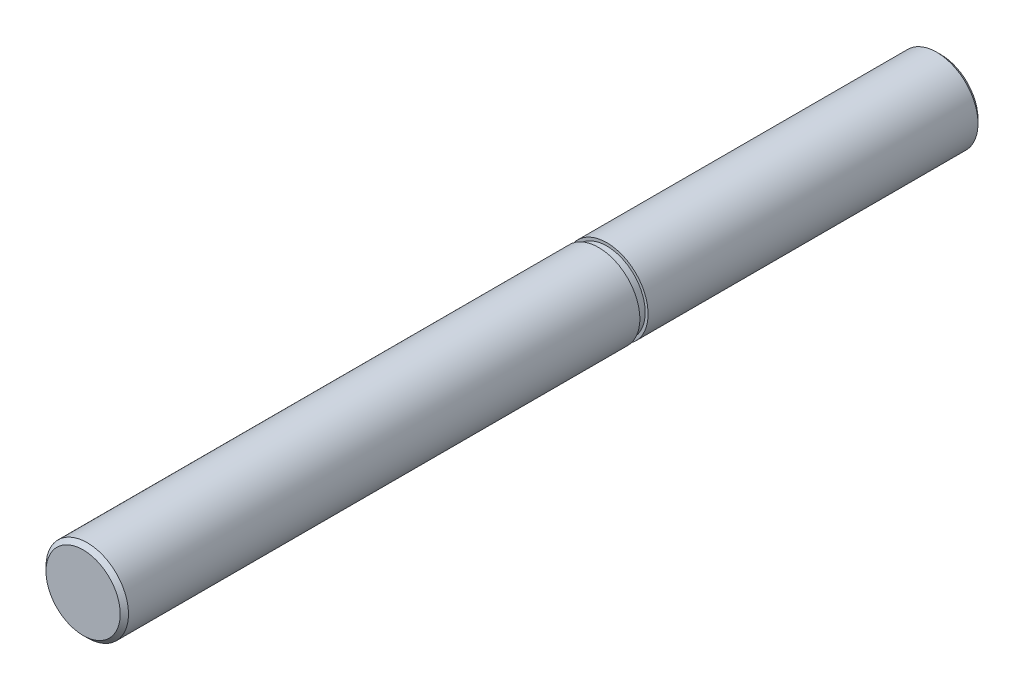
ISO-10303-21;
HEADER;
FILE_DESCRIPTION(('STEP AP214'),'2;1');
FILE_NAME('part.step','',(''),(''),'','','');
FILE_SCHEMA(('AUTOMOTIVE_DESIGN { 1 0 10303 214 1 1 1 1 }'));
ENDSEC;
DATA;
#1=APPLICATION_CONTEXT('core data for automotive mechanical design processes');
#2=APPLICATION_PROTOCOL_DEFINITION('international standard','automotive_design',2000,#1);
#3=PRODUCT_CONTEXT('',#1,'mechanical');
#4=PRODUCT('Part','Part','',(#3));
#5=PRODUCT_RELATED_PRODUCT_CATEGORY('part','',(#4));
#6=PRODUCT_DEFINITION_FORMATION('','',#4);
#7=PRODUCT_DEFINITION_CONTEXT('part definition',#1,'design');
#8=PRODUCT_DEFINITION('design','',#6,#7);
#9=PRODUCT_DEFINITION_SHAPE('','',#8);
#10=(LENGTH_UNIT() NAMED_UNIT(*) SI_UNIT(.MILLI.,.METRE.));
#11=(NAMED_UNIT(*) PLANE_ANGLE_UNIT() SI_UNIT($,.RADIAN.));
#12=(NAMED_UNIT(*) SI_UNIT($,.STERADIAN.) SOLID_ANGLE_UNIT());
#13=UNCERTAINTY_MEASURE_WITH_UNIT(LENGTH_MEASURE(1.E-05),#10,'distance_accuracy_value','');
#14=(GEOMETRIC_REPRESENTATION_CONTEXT(3) GLOBAL_UNCERTAINTY_ASSIGNED_CONTEXT((#13)) GLOBAL_UNIT_ASSIGNED_CONTEXT((#10,
#11,#12)) REPRESENTATION_CONTEXT('',''));
#15=CARTESIAN_POINT('',(0.,0.,0.));
#16=DIRECTION('',(0.,0.,1.));
#17=DIRECTION('',(1.,0.,0.));
#18=AXIS2_PLACEMENT_3D('',#15,#16,#17);
#19=CARTESIAN_POINT('',(0.,0.,104.));
#20=DIRECTION('',(0.,0.,-1.));
#21=DIRECTION('',(-1.,0.,0.));
#22=AXIS2_PLACEMENT_3D('',#19,#20,#21);
#23=CYLINDRICAL_SURFACE('',#22,5.);
#24=CARTESIAN_POINT('',(0.,0.,0.50000000000007));
#25=DIRECTION('',(0.,0.,1.));
#26=DIRECTION('',(1.,0.,0.));
#27=AXIS2_PLACEMENT_3D('',#24,#25,#26);
#28=CIRCLE('',#27,5.);
#29=CARTESIAN_POINT('',(-5.,0.,0.500000000000056));
#30=VERTEX_POINT('',#29);
#31=EDGE_CURVE('E39',#30,#30,#28,.T.);
#32=CARTESIAN_POINT('',(0.,0.,40.5));
#33=DIRECTION('',(0.,0.,-1.));
#34=DIRECTION('',(-1.,0.,0.));
#35=AXIS2_PLACEMENT_3D('',#32,#33,#34);
#36=CIRCLE('',#35,5.);
#37=CARTESIAN_POINT('',(-5.,0.,40.5));
#38=VERTEX_POINT('',#37);
#39=EDGE_CURVE('E52',#38,#38,#36,.T.);
#40=CARTESIAN_POINT('',(-5.,0.,0.500000000000056));
#41=CARTESIAN_POINT('',(-5.,0.,0.916666666666723));
#42=CARTESIAN_POINT('',(-5.,0.,1.33333333333339));
#43=CARTESIAN_POINT('',(-5.,0.,2.16666666666672));
#44=CARTESIAN_POINT('',(-5.,0.,2.58333333333339));
#45=CARTESIAN_POINT('',(-5.,0.,3.41666666666672));
#46=CARTESIAN_POINT('',(-5.,0.,3.83333333333338));
#47=CARTESIAN_POINT('',(-5.,0.,4.66666666666671));
#48=CARTESIAN_POINT('',(-5.,0.,5.08333333333338));
#49=CARTESIAN_POINT('',(-5.,0.,5.91666666666671));
#50=CARTESIAN_POINT('',(-5.,0.,6.33333333333338));
#51=CARTESIAN_POINT('',(-5.,0.,7.16666666666671));
#52=CARTESIAN_POINT('',(-5.,0.,7.58333333333338));
#53=CARTESIAN_POINT('',(-5.,0.,8.41666666666672));
#54=CARTESIAN_POINT('',(-5.,0.,8.83333333333338));
#55=CARTESIAN_POINT('',(-5.,0.,9.66666666666671));
#56=CARTESIAN_POINT('',(-5.,0.,10.0833333333334));
#57=CARTESIAN_POINT('',(-5.,0.,10.9166666666667));
#58=CARTESIAN_POINT('',(-5.,0.,11.3333333333334));
#59=CARTESIAN_POINT('',(-5.,0.,12.1666666666667));
#60=CARTESIAN_POINT('',(-5.,0.,12.5833333333334));
#61=CARTESIAN_POINT('',(-5.,0.,13.4166666666667));
#62=CARTESIAN_POINT('',(-5.,0.,13.8333333333334));
#63=CARTESIAN_POINT('',(-5.,0.,14.6666666666667));
#64=CARTESIAN_POINT('',(-5.,0.,15.0833333333334));
#65=CARTESIAN_POINT('',(-5.,0.,15.9166666666667));
#66=CARTESIAN_POINT('',(-5.,0.,16.3333333333334));
#67=CARTESIAN_POINT('',(-5.,0.,17.1666666666667));
#68=CARTESIAN_POINT('',(-5.,0.,17.5833333333334));
#69=CARTESIAN_POINT('',(-5.,0.,18.4166666666667));
#70=CARTESIAN_POINT('',(-5.,0.,18.8333333333334));
#71=CARTESIAN_POINT('',(-5.,0.,19.6666666666667));
#72=CARTESIAN_POINT('',(-5.,0.,20.0833333333334));
#73=CARTESIAN_POINT('',(-5.,0.,20.9166666666667));
#74=CARTESIAN_POINT('',(-5.,0.,21.3333333333334));
#75=CARTESIAN_POINT('',(-5.,0.,22.1666666666667));
#76=CARTESIAN_POINT('',(-5.,0.,22.5833333333334));
#77=CARTESIAN_POINT('',(-5.,0.,23.4166666666667));
#78=CARTESIAN_POINT('',(-5.,0.,23.8333333333334));
#79=CARTESIAN_POINT('',(-5.,0.,24.6666666666667));
#80=CARTESIAN_POINT('',(-5.,0.,25.0833333333334));
#81=CARTESIAN_POINT('',(-5.,0.,25.9166666666667));
#82=CARTESIAN_POINT('',(-5.,0.,26.3333333333334));
#83=CARTESIAN_POINT('',(-5.,0.,27.1666666666667));
#84=CARTESIAN_POINT('',(-5.,0.,27.5833333333334));
#85=CARTESIAN_POINT('',(-5.,0.,28.4166666666667));
#86=CARTESIAN_POINT('',(-5.,0.,28.8333333333334));
#87=CARTESIAN_POINT('',(-5.,0.,29.6666666666667));
#88=CARTESIAN_POINT('',(-5.,0.,30.0833333333334));
#89=CARTESIAN_POINT('',(-5.,0.,30.9166666666667));
#90=CARTESIAN_POINT('',(-5.,0.,31.3333333333334));
#91=CARTESIAN_POINT('',(-5.,0.,32.1666666666667));
#92=CARTESIAN_POINT('',(-5.,0.,32.5833333333333));
#93=CARTESIAN_POINT('',(-5.,0.,33.4166666666667));
#94=CARTESIAN_POINT('',(-5.,0.,33.8333333333333));
#95=CARTESIAN_POINT('',(-5.,0.,34.6666666666667));
#96=CARTESIAN_POINT('',(-5.,0.,35.0833333333333));
#97=CARTESIAN_POINT('',(-5.,0.,35.9166666666667));
#98=CARTESIAN_POINT('',(-5.,0.,36.3333333333333));
#99=CARTESIAN_POINT('',(-5.,0.,37.1666666666667));
#100=CARTESIAN_POINT('',(-5.,0.,37.5833333333333));
#101=CARTESIAN_POINT('',(-5.,0.,38.4166666666667));
#102=CARTESIAN_POINT('',(-5.,0.,38.8333333333333));
#103=CARTESIAN_POINT('',(-5.,0.,39.6666666666667));
#104=CARTESIAN_POINT('',(-5.,0.,40.0833333333333));
#105=CARTESIAN_POINT('',(-5.,0.,40.5));
#106=B_SPLINE_CURVE_WITH_KNOTS('',3,(#40,#41,#42,#43,#44,#45,#46,#47,#48,#49,#50,#51,#52,#53,
#54,#55,#56,#57,#58,#59,#60,#61,#62,#63,#64,#65,#66,#67,#68,#69,#70,#71,#72,#73,#74,#75,#76,#77,
#78,#79,#80,#81,#82,#83,#84,#85,#86,#87,#88,#89,#90,#91,#92,#93,#94,#95,#96,#97,#98,#99,#100,
#101,#102,#103,#104,#105),.UNSPECIFIED.,.F.,.F.,(4,2,2,2,2,2,2,2,2,2,2,2,2,2,2,2,2,2,2,2,2,2,2,
2,2,2,2,2,2,2,2,2,4),(0.,1.25,2.5,3.74999999999999,4.99999999999999,6.24999999999999,
7.49999999999999,8.74999999999999,9.99999999999998,11.25,12.5,13.75,15.,16.25,17.5,18.75,20.,
21.25,22.5,23.75,25.,26.25,27.5,28.75,30.,31.25,32.5,33.75,35.,36.25,37.5,38.75,40.),.UNSPECIFIED.);
#107=EDGE_CURVE('BSEAM32',#30,#38,#106,.T.);
#108=ORIENTED_EDGE('',*,*,#31,.T.);
#109=ORIENTED_EDGE('',*,*,#39,.T.);
#110=ORIENTED_EDGE('',*,*,#107,.T.);
#111=ORIENTED_EDGE('',*,*,#107,.F.);
#112=EDGE_LOOP('',(#108,#110,#109,#111));
#113=FACE_BOUND('',#112,.T.);
#114=ADVANCED_FACE('F32',(#113),#23,.T.);
#115=CARTESIAN_POINT('',(0.,0.,0.));
#116=DIRECTION('',(0.,0.,1.));
#117=DIRECTION('',(1.,0.,0.));
#118=AXIS2_PLACEMENT_3D('',#115,#116,#117);
#119=PLANE('',#118);
#120=CARTESIAN_POINT('',(0.,0.,0.));
#121=DIRECTION('',(0.,0.,1.));
#122=DIRECTION('',(1.,0.,0.));
#123=AXIS2_PLACEMENT_3D('',#120,#121,#122);
#124=CIRCLE('',#123,4.49999999999995);
#125=CARTESIAN_POINT('',(4.49999999999995,0.,0.));
#126=VERTEX_POINT('',#125);
#127=EDGE_CURVE('E10',#126,#126,#124,.F.);
#128=ORIENTED_EDGE('',*,*,#127,.T.);
#129=EDGE_LOOP('',(#128));
#130=FACE_BOUND('',#129,.T.);
#131=ADVANCED_FACE('F78',(#130),#119,.F.);
#132=CARTESIAN_POINT('',(4.65,0.,40.5));
#133=DIRECTION('',(0.,0.,-1.));
#134=DIRECTION('',(-1.,0.,0.));
#135=AXIS2_PLACEMENT_3D('',#132,#133,#134);
#136=PLANE('',#135);
#137=CARTESIAN_POINT('',(0.,0.,40.5));
#138=DIRECTION('',(0.,0.,1.));
#139=DIRECTION('',(1.,0.,0.));
#140=AXIS2_PLACEMENT_3D('',#137,#138,#139);
#141=CIRCLE('',#140,4.65);
#142=CARTESIAN_POINT('',(4.65,0.,40.5));
#143=VERTEX_POINT('',#142);
#144=EDGE_CURVE('E58',#143,#143,#141,.T.);
#145=ORIENTED_EDGE('',*,*,#144,.F.);
#146=EDGE_LOOP('',(#145));
#147=FACE_BOUND('',#146,.T.);
#148=ORIENTED_EDGE('',*,*,#39,.F.);
#149=EDGE_LOOP('',(#148));
#150=FACE_BOUND('',#149,.T.);
#151=ADVANCED_FACE('F75',(#147,#150),#136,.F.);
#152=CARTESIAN_POINT('',(4.65,0.,41.5));
#153=DIRECTION('',(0.,0.,1.));
#154=DIRECTION('',(1.,0.,0.));
#155=AXIS2_PLACEMENT_3D('',#152,#153,#154);
#156=PLANE('',#155);
#157=CARTESIAN_POINT('',(0.,0.,41.5));
#158=DIRECTION('',(0.,0.,1.));
#159=DIRECTION('',(1.,0.,0.));
#160=AXIS2_PLACEMENT_3D('',#157,#158,#159);
#161=CIRCLE('',#160,4.65);
#162=CARTESIAN_POINT('',(4.65,0.,41.5));
#163=VERTEX_POINT('',#162);
#164=EDGE_CURVE('E61',#163,#163,#161,.T.);
#165=ORIENTED_EDGE('',*,*,#164,.T.);
#166=EDGE_LOOP('',(#165));
#167=FACE_BOUND('',#166,.T.);
#168=CARTESIAN_POINT('',(0.,0.,41.5));
#169=DIRECTION('',(0.,0.,1.));
#170=DIRECTION('',(1.,0.,0.));
#171=AXIS2_PLACEMENT_3D('',#168,#169,#170);
#172=CIRCLE('',#171,5.);
#173=CARTESIAN_POINT('',(-5.,0.,41.5));
#174=VERTEX_POINT('',#173);
#175=EDGE_CURVE('E55',#174,#174,#172,.T.);
#176=ORIENTED_EDGE('',*,*,#175,.F.);
#177=EDGE_LOOP('',(#176));
#178=FACE_BOUND('',#177,.T.);
#179=ADVANCED_FACE('F65',(#167,#178),#156,.F.);
#180=CARTESIAN_POINT('',(0.,0.,104.));
#181=DIRECTION('',(0.,0.,1.));
#182=DIRECTION('',(1.,0.,0.));
#183=AXIS2_PLACEMENT_3D('',#180,#181,#182);
#184=CYLINDRICAL_SURFACE('',#183,4.65);
#185=ORIENTED_EDGE('',*,*,#164,.F.);
#186=EDGE_LOOP('',(#185));
#187=FACE_BOUND('',#186,.T.);
#188=ORIENTED_EDGE('',*,*,#144,.T.);
#189=EDGE_LOOP('',(#188));
#190=FACE_BOUND('',#189,.T.);
#191=ADVANCED_FACE('F68',(#187,#190),#184,.T.);
#192=CARTESIAN_POINT('',(0.,0.,104.));
#193=DIRECTION('',(0.,0.,1.));
#194=DIRECTION('',(1.,0.,0.));
#195=AXIS2_PLACEMENT_3D('',#192,#193,#194);
#196=PLANE('',#195);
#197=CARTESIAN_POINT('',(0.,0.,104.));
#198=DIRECTION('',(0.,0.,1.));
#199=DIRECTION('',(1.,0.,0.));
#200=AXIS2_PLACEMENT_3D('',#197,#198,#199);
#201=CIRCLE('',#200,4.50000000000004);
#202=CARTESIAN_POINT('',(4.50000000000004,0.,104.));
#203=VERTEX_POINT('',#202);
#204=EDGE_CURVE('E47',#203,#203,#201,.T.);
#205=ORIENTED_EDGE('',*,*,#204,.T.);
#206=EDGE_LOOP('',(#205));
#207=FACE_BOUND('',#206,.T.);
#208=ADVANCED_FACE('F71',(#207),#196,.T.);
#209=CARTESIAN_POINT('',(0.,0.,103.5));
#210=DIRECTION('',(0.,0.,1.));
#211=DIRECTION('',(1.,0.,0.));
#212=AXIS2_PLACEMENT_3D('',#209,#210,#211);
#213=CIRCLE('',#212,5.);
#214=CARTESIAN_POINT('',(-5.,0.,103.5));
#215=VERTEX_POINT('',#214);
#216=EDGE_CURVE('E43',#215,#215,#213,.F.);
#217=CARTESIAN_POINT('',(-5.,0.,103.5));
#218=CARTESIAN_POINT('',(-5.,0.,102.854166666667));
#219=CARTESIAN_POINT('',(-5.,0.,102.208333333333));
#220=CARTESIAN_POINT('',(-5.,0.,100.916666666667));
#221=CARTESIAN_POINT('',(-5.,0.,100.270833333333));
#222=CARTESIAN_POINT('',(-5.,0.,98.9791666666667));
#223=CARTESIAN_POINT('',(-5.,0.,98.3333333333334));
#224=CARTESIAN_POINT('',(-5.,0.,97.0416666666667));
#225=CARTESIAN_POINT('',(-5.,0.,96.3958333333334));
#226=CARTESIAN_POINT('',(-5.,0.,95.1041666666667));
#227=CARTESIAN_POINT('',(-5.,0.,94.4583333333334));
#228=CARTESIAN_POINT('',(-5.,0.,93.1666666666667));
#229=CARTESIAN_POINT('',(-5.,0.,92.5208333333334));
#230=CARTESIAN_POINT('',(-5.,0.,91.2291666666667));
#231=CARTESIAN_POINT('',(-5.,0.,90.5833333333334));
#232=CARTESIAN_POINT('',(-5.,0.,89.2916666666667));
#233=CARTESIAN_POINT('',(-5.,0.,88.6458333333334));
#234=CARTESIAN_POINT('',(-5.,0.,87.3541666666667));
#235=CARTESIAN_POINT('',(-5.,0.,86.7083333333334));
#236=CARTESIAN_POINT('',(-5.,0.,85.4166666666667));
#237=CARTESIAN_POINT('',(-5.,0.,84.7708333333334));
#238=CARTESIAN_POINT('',(-5.,0.,83.4791666666667));
#239=CARTESIAN_POINT('',(-5.,0.,82.8333333333334));
#240=CARTESIAN_POINT('',(-5.,0.,81.5416666666667));
#241=CARTESIAN_POINT('',(-5.,0.,80.8958333333333));
#242=CARTESIAN_POINT('',(-5.,0.,79.6041666666667));
#243=CARTESIAN_POINT('',(-5.,0.,78.9583333333334));
#244=CARTESIAN_POINT('',(-5.,0.,77.6666666666667));
#245=CARTESIAN_POINT('',(-5.,0.,77.0208333333333));
#246=CARTESIAN_POINT('',(-5.,0.,75.7291666666667));
#247=CARTESIAN_POINT('',(-5.,0.,75.0833333333333));
#248=CARTESIAN_POINT('',(-5.,0.,73.7916666666667));
#249=CARTESIAN_POINT('',(-5.,0.,73.1458333333333));
#250=CARTESIAN_POINT('',(-5.,0.,71.8541666666667));
#251=CARTESIAN_POINT('',(-5.,0.,71.2083333333333));
#252=CARTESIAN_POINT('',(-5.,0.,69.9166666666667));
#253=CARTESIAN_POINT('',(-5.,0.,69.2708333333333));
#254=CARTESIAN_POINT('',(-5.,0.,67.9791666666667));
#255=CARTESIAN_POINT('',(-5.,0.,67.3333333333333));
#256=CARTESIAN_POINT('',(-5.,0.,66.0416666666667));
#257=CARTESIAN_POINT('',(-5.,0.,65.3958333333333));
#258=CARTESIAN_POINT('',(-5.,0.,64.1041666666667));
#259=CARTESIAN_POINT('',(-5.,0.,63.4583333333333));
#260=CARTESIAN_POINT('',(-5.,0.,62.1666666666667));
#261=CARTESIAN_POINT('',(-5.,0.,61.5208333333333));
#262=CARTESIAN_POINT('',(-5.,0.,60.2291666666667));
#263=CARTESIAN_POINT('',(-5.,0.,59.5833333333333));
#264=CARTESIAN_POINT('',(-5.,0.,58.2916666666667));
#265=CARTESIAN_POINT('',(-5.,0.,57.6458333333333));
#266=CARTESIAN_POINT('',(-5.,0.,56.3541666666667));
#267=CARTESIAN_POINT('',(-5.,0.,55.7083333333333));
#268=CARTESIAN_POINT('',(-5.,0.,54.4166666666667));
#269=CARTESIAN_POINT('',(-5.,0.,53.7708333333333));
#270=CARTESIAN_POINT('',(-5.,0.,52.4791666666667));
#271=CARTESIAN_POINT('',(-5.,0.,51.8333333333333));
#272=CARTESIAN_POINT('',(-5.,0.,50.5416666666667));
#273=CARTESIAN_POINT('',(-5.,0.,49.8958333333333));
#274=CARTESIAN_POINT('',(-5.,0.,48.6041666666667));
#275=CARTESIAN_POINT('',(-5.,0.,47.9583333333333));
#276=CARTESIAN_POINT('',(-5.,0.,46.6666666666667));
#277=CARTESIAN_POINT('',(-5.,0.,46.0208333333333));
#278=CARTESIAN_POINT('',(-5.,0.,44.7291666666666));
#279=CARTESIAN_POINT('',(-5.,0.,44.0833333333333));
#280=CARTESIAN_POINT('',(-5.,0.,42.7916666666666));
#281=CARTESIAN_POINT('',(-5.,0.,42.1458333333333));
#282=CARTESIAN_POINT('',(-5.,0.,41.5));
#283=B_SPLINE_CURVE_WITH_KNOTS('',3,(#217,#218,#219,#220,#221,#222,#223,#224,#225,#226,#227,
#228,#229,#230,#231,#232,#233,#234,#235,#236,#237,#238,#239,#240,#241,#242,#243,#244,#245,#246,
#247,#248,#249,#250,#251,#252,#253,#254,#255,#256,#257,#258,#259,#260,#261,#262,#263,#264,#265,
#266,#267,#268,#269,#270,#271,#272,#273,#274,#275,#276,#277,#278,#279,#280,#281,#282),
.UNSPECIFIED.,.F.,.F.,(4,2,2,2,2,2,2,2,2,2,2,2,2,2,2,2,2,2,2,2,2,2,2,2,2,2,2,2,2,2,2,2,4),(0.,
1.93750000000001,3.87500000000002,5.81250000000001,7.75000000000002,9.68750000000002,11.625,
13.5625,15.5,17.4375,19.375,21.3125,23.25,25.1875,27.125,29.0625,31.,32.9375,34.875,36.8125,
38.75,40.6875000000001,42.625,44.5625000000001,46.5000000000001,48.4375000000001,
50.3750000000001,52.3125000000001,54.2500000000001,56.1875000000001,58.1250000000001,
60.0625000000001,62.0000000000001),.UNSPECIFIED.);
#284=EDGE_CURVE('BSEAM84',#215,#174,#283,.T.);
#285=ORIENTED_EDGE('',*,*,#216,.T.);
#286=ORIENTED_EDGE('',*,*,#175,.T.);
#287=ORIENTED_EDGE('',*,*,#284,.T.);
#288=ORIENTED_EDGE('',*,*,#284,.F.);
#289=EDGE_LOOP('',(#285,#287,#286,#288));
#290=FACE_BOUND('',#289,.T.);
#291=ADVANCED_FACE('F84',(#290),#23,.T.);
#292=CARTESIAN_POINT('',(0.,0.,104.));
#293=DIRECTION('',(0.,0.,-1.));
#294=DIRECTION('',(-1.,0.,0.));
#295=AXIS2_PLACEMENT_3D('',#292,#293,#294);
#296=CONICAL_SURFACE('',#295,4.50000000000004,0.785398163397459);
#297=ORIENTED_EDGE('',*,*,#216,.F.);
#298=EDGE_LOOP('',(#297));
#299=FACE_BOUND('',#298,.T.);
#300=ORIENTED_EDGE('',*,*,#204,.F.);
#301=EDGE_LOOP('',(#300));
#302=FACE_BOUND('',#301,.T.);
#303=ADVANCED_FACE('F90',(#299,#302),#296,.T.);
#304=CARTESIAN_POINT('',(0.,0.,0.50000000000007));
#305=DIRECTION('',(0.,0.,1.));
#306=DIRECTION('',(1.,0.,0.));
#307=AXIS2_PLACEMENT_3D('',#304,#305,#306);
#308=CONICAL_SURFACE('',#307,5.,0.785398163397431);
#309=ORIENTED_EDGE('',*,*,#127,.F.);
#310=EDGE_LOOP('',(#309));
#311=FACE_BOUND('',#310,.T.);
#312=ORIENTED_EDGE('',*,*,#31,.F.);
#313=EDGE_LOOP('',(#312));
#314=FACE_BOUND('',#313,.T.);
#315=ADVANCED_FACE('F34',(#311,#314),#308,.T.);
#316=CLOSED_SHELL('',(#114,#131,#151,#179,#191,#208,#291,#303,#315));
#317=MANIFOLD_SOLID_BREP('B2',#316);
#318=ADVANCED_BREP_SHAPE_REPRESENTATION('',(#18,#317),#14);
#319=SHAPE_DEFINITION_REPRESENTATION(#9,#318);
ENDSEC;
END-ISO-10303-21;
